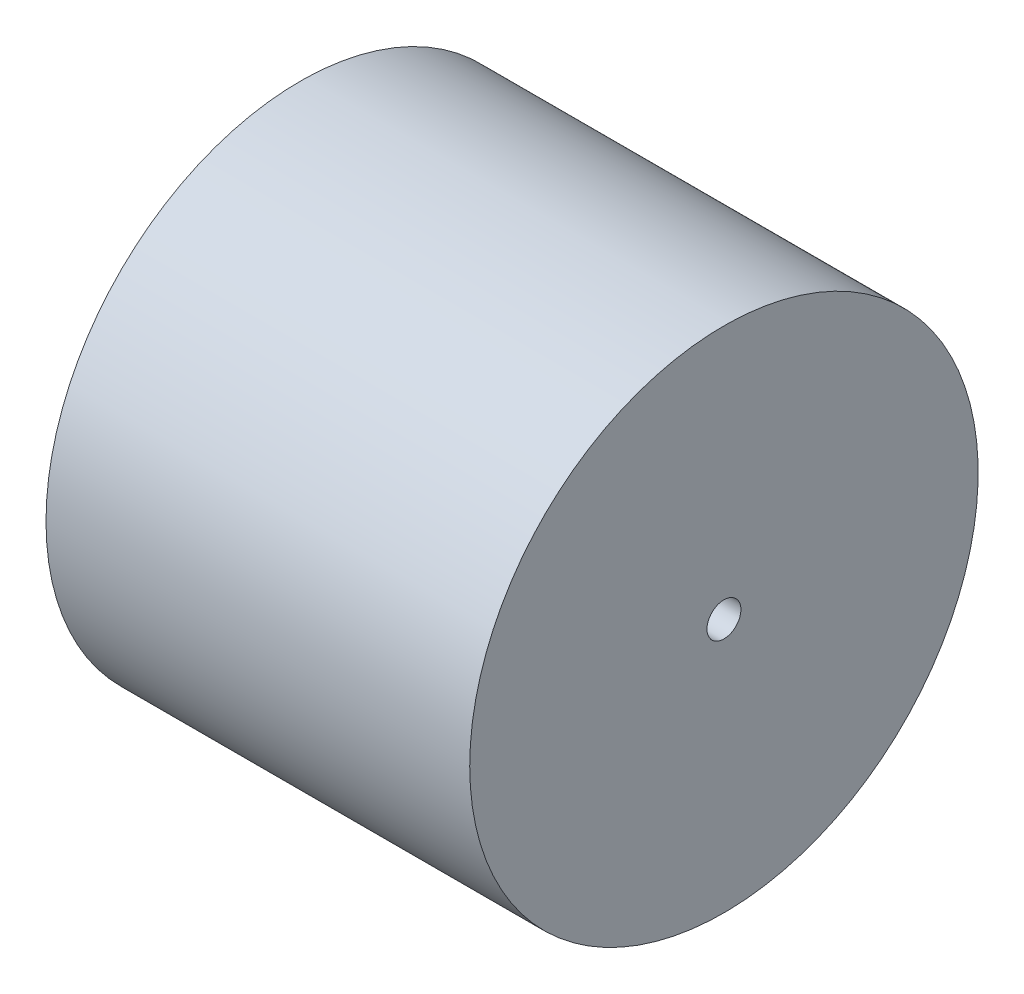
ISO-10303-21;
HEADER;
FILE_DESCRIPTION(('STEP AP214'),'2;1');
FILE_NAME('part.step','',(''),(''),'','','');
FILE_SCHEMA(('AUTOMOTIVE_DESIGN { 1 0 10303 214 1 1 1 1 }'));
ENDSEC;
DATA;
#1=APPLICATION_CONTEXT('core data for automotive mechanical design processes');
#2=APPLICATION_PROTOCOL_DEFINITION('international standard','automotive_design',2000,#1);
#3=PRODUCT_CONTEXT('',#1,'mechanical');
#4=PRODUCT('Part','Part','',(#3));
#5=PRODUCT_RELATED_PRODUCT_CATEGORY('part','',(#4));
#6=PRODUCT_DEFINITION_FORMATION('','',#4);
#7=PRODUCT_DEFINITION_CONTEXT('part definition',#1,'design');
#8=PRODUCT_DEFINITION('design','',#6,#7);
#9=PRODUCT_DEFINITION_SHAPE('','',#8);
#10=(LENGTH_UNIT() NAMED_UNIT(*) SI_UNIT(.MILLI.,.METRE.));
#11=(NAMED_UNIT(*) PLANE_ANGLE_UNIT() SI_UNIT($,.RADIAN.));
#12=(NAMED_UNIT(*) SI_UNIT($,.STERADIAN.) SOLID_ANGLE_UNIT());
#13=UNCERTAINTY_MEASURE_WITH_UNIT(LENGTH_MEASURE(1.E-05),#10,'distance_accuracy_value','');
#14=(GEOMETRIC_REPRESENTATION_CONTEXT(3) GLOBAL_UNCERTAINTY_ASSIGNED_CONTEXT((#13)) GLOBAL_UNIT_ASSIGNED_CONTEXT((#10,
#11,#12)) REPRESENTATION_CONTEXT('',''));
#15=CARTESIAN_POINT('',(0.,0.,0.));
#16=DIRECTION('',(0.,0.,1.));
#17=DIRECTION('',(1.,0.,0.));
#18=AXIS2_PLACEMENT_3D('',#15,#16,#17);
#19=CARTESIAN_POINT('',(5.,0.,0.));
#20=DIRECTION('',(-1.,0.,0.));
#21=DIRECTION('',(0.,0.,1.));
#22=AXIS2_PLACEMENT_3D('',#19,#20,#21);
#23=PLANE('',#22);
#24=CARTESIAN_POINT('',(5.,0.,0.));
#25=DIRECTION('',(1.,0.,0.));
#26=DIRECTION('',(0.,0.,-1.));
#27=AXIS2_PLACEMENT_3D('',#24,#25,#26);
#28=CIRCLE('',#27,1.2);
#29=CARTESIAN_POINT('',(5.,0.,-1.2));
#30=VERTEX_POINT('',#29);
#31=EDGE_CURVE('E66',#30,#30,#28,.T.);
#32=ORIENTED_EDGE('',*,*,#31,.F.);
#33=EDGE_LOOP('',(#32));
#34=FACE_BOUND('',#33,.T.);
#35=CARTESIAN_POINT('',(5.,0.,0.));
#36=DIRECTION('',(-1.,0.,0.));
#37=DIRECTION('',(0.,0.,1.));
#38=AXIS2_PLACEMENT_3D('',#35,#36,#37);
#39=CIRCLE('',#38,18.);
#40=CARTESIAN_POINT('',(5.,0.,18.));
#41=VERTEX_POINT('',#40);
#42=EDGE_CURVE('E55',#41,#41,#39,.T.);
#43=ORIENTED_EDGE('',*,*,#42,.F.);
#44=EDGE_LOOP('',(#43));
#45=FACE_BOUND('',#44,.T.);
#46=ADVANCED_FACE('F37',(#34,#45),#23,.F.);
#47=CARTESIAN_POINT('',(-25.,0.,0.));
#48=DIRECTION('',(-1.,0.,0.));
#49=DIRECTION('',(0.,0.,1.));
#50=AXIS2_PLACEMENT_3D('',#47,#48,#49);
#51=CYLINDRICAL_SURFACE('',#50,18.);
#52=CARTESIAN_POINT('',(-25.,0.,0.));
#53=DIRECTION('',(-1.,0.,0.));
#54=DIRECTION('',(0.,0.,1.));
#55=AXIS2_PLACEMENT_3D('',#52,#53,#54);
#56=CIRCLE('',#55,18.);
#57=CARTESIAN_POINT('',(-25.,0.,18.));
#58=VERTEX_POINT('',#57);
#59=EDGE_CURVE('E61',#58,#58,#56,.T.);
#60=ORIENTED_EDGE('',*,*,#59,.F.);
#61=EDGE_LOOP('',(#60));
#62=FACE_BOUND('',#61,.T.);
#63=ORIENTED_EDGE('',*,*,#42,.T.);
#64=EDGE_LOOP('',(#63));
#65=FACE_BOUND('',#64,.T.);
#66=ADVANCED_FACE('F103',(#62,#65),#51,.T.);
#67=CARTESIAN_POINT('',(-25.,18.,0.));
#68=DIRECTION('',(1.,0.,0.));
#69=DIRECTION('',(0.,0.,-1.));
#70=AXIS2_PLACEMENT_3D('',#67,#68,#69);
#71=PLANE('',#70);
#72=CARTESIAN_POINT('',(-25.,0.,-12.));
#73=DIRECTION('',(-1.,0.,0.));
#74=DIRECTION('',(0.,0.,1.));
#75=AXIS2_PLACEMENT_3D('',#72,#73,#74);
#76=CIRCLE('',#75,1.65);
#77=CARTESIAN_POINT('',(-25.,0.,-10.35));
#78=VERTEX_POINT('',#77);
#79=EDGE_CURVE('E82',#78,#78,#76,.T.);
#80=ORIENTED_EDGE('',*,*,#79,.F.);
#81=EDGE_LOOP('',(#80));
#82=FACE_BOUND('',#81,.T.);
#83=CARTESIAN_POINT('',(-25.,0.,12.));
#84=DIRECTION('',(-1.,0.,0.));
#85=DIRECTION('',(0.,0.,1.));
#86=AXIS2_PLACEMENT_3D('',#83,#84,#85);
#87=CIRCLE('',#86,1.65);
#88=CARTESIAN_POINT('',(-25.,0.,13.65));
#89=VERTEX_POINT('',#88);
#90=EDGE_CURVE('E74',#89,#89,#87,.T.);
#91=ORIENTED_EDGE('',*,*,#90,.F.);
#92=EDGE_LOOP('',(#91));
#93=FACE_BOUND('',#92,.T.);
#94=CARTESIAN_POINT('',(-25.,0.,0.));
#95=DIRECTION('',(-1.,0.,0.));
#96=DIRECTION('',(0.,0.,1.));
#97=AXIS2_PLACEMENT_3D('',#94,#95,#96);
#98=CIRCLE('',#97,3.5);
#99=CARTESIAN_POINT('',(-25.,0.,3.5));
#100=VERTEX_POINT('',#99);
#101=EDGE_CURVE('E50',#100,#100,#98,.T.);
#102=ORIENTED_EDGE('',*,*,#101,.F.);
#103=EDGE_LOOP('',(#102));
#104=FACE_BOUND('',#103,.T.);
#105=ORIENTED_EDGE('',*,*,#59,.T.);
#106=EDGE_LOOP('',(#105));
#107=FACE_BOUND('',#106,.T.);
#108=ADVANCED_FACE('F99',(#82,#93,#104,#107),#71,.F.);
#109=CARTESIAN_POINT('',(0.999999999999997,0.,0.));
#110=DIRECTION('',(1.,0.,0.));
#111=DIRECTION('',(0.,0.,-1.));
#112=AXIS2_PLACEMENT_3D('',#109,#110,#111);
#113=CYLINDRICAL_SURFACE('',#112,1.2);
#114=CARTESIAN_POINT('',(0.999999999999997,0.,0.));
#115=DIRECTION('',(1.,0.,0.));
#116=DIRECTION('',(0.,0.,-1.));
#117=AXIS2_PLACEMENT_3D('',#114,#115,#116);
#118=CIRCLE('',#117,1.2);
#119=CARTESIAN_POINT('',(0.999999999999997,0.,-1.2));
#120=VERTEX_POINT('',#119);
#121=EDGE_CURVE('E65',#120,#120,#118,.T.);
#122=ORIENTED_EDGE('',*,*,#121,.F.);
#123=EDGE_LOOP('',(#122));
#124=FACE_BOUND('',#123,.T.);
#125=ORIENTED_EDGE('',*,*,#31,.T.);
#126=EDGE_LOOP('',(#125));
#127=FACE_BOUND('',#126,.T.);
#128=ADVANCED_FACE('F102',(#124,#127),#113,.F.);
#129=CARTESIAN_POINT('',(0.999999999999997,0.,0.));
#130=DIRECTION('',(1.,0.,0.));
#131=DIRECTION('',(0.,0.,-1.));
#132=AXIS2_PLACEMENT_3D('',#129,#130,#131);
#133=PLANE('',#132);
#134=ORIENTED_EDGE('',*,*,#121,.T.);
#135=EDGE_LOOP('',(#134));
#136=FACE_BOUND('',#135,.T.);
#137=ADVANCED_FACE('F126',(#136),#133,.T.);
#138=CARTESIAN_POINT('',(-26.5,0.,0.));
#139=DIRECTION('',(1.,0.,0.));
#140=DIRECTION('',(0.,0.,-1.));
#141=AXIS2_PLACEMENT_3D('',#138,#139,#140);
#142=CYLINDRICAL_SURFACE('',#141,3.5);
#143=CARTESIAN_POINT('',(-26.25,0.,0.));
#144=DIRECTION('',(-1.,0.,0.));
#145=DIRECTION('',(0.,0.,1.));
#146=AXIS2_PLACEMENT_3D('',#143,#144,#145);
#147=CIRCLE('',#146,3.5);
#148=CARTESIAN_POINT('',(-26.25,0.,3.5));
#149=VERTEX_POINT('',#148);
#150=EDGE_CURVE('E10',#149,#149,#147,.F.);
#151=ORIENTED_EDGE('',*,*,#150,.T.);
#152=EDGE_LOOP('',(#151));
#153=FACE_BOUND('',#152,.T.);
#154=ORIENTED_EDGE('',*,*,#101,.T.);
#155=EDGE_LOOP('',(#154));
#156=FACE_BOUND('',#155,.T.);
#157=ADVANCED_FACE('F130',(#153,#156),#142,.T.);
#158=CARTESIAN_POINT('',(-26.5,0.,0.));
#159=DIRECTION('',(-1.,0.,0.));
#160=DIRECTION('',(0.,0.,1.));
#161=AXIS2_PLACEMENT_3D('',#158,#159,#160);
#162=PLANE('',#161);
#163=CARTESIAN_POINT('',(-26.5,0.,0.));
#164=DIRECTION('',(-1.,0.,0.));
#165=DIRECTION('',(0.,0.,1.));
#166=AXIS2_PLACEMENT_3D('',#163,#164,#165);
#167=CIRCLE('',#166,3.25);
#168=CARTESIAN_POINT('',(-26.5,0.,3.25));
#169=VERTEX_POINT('',#168);
#170=EDGE_CURVE('E45',#169,#169,#167,.T.);
#171=ORIENTED_EDGE('',*,*,#170,.T.);
#172=EDGE_LOOP('',(#171));
#173=FACE_BOUND('',#172,.T.);
#174=ADVANCED_FACE('F134',(#173),#162,.T.);
#175=CARTESIAN_POINT('',(-26.25,0.,0.));
#176=DIRECTION('',(-1.,0.,0.));
#177=DIRECTION('',(0.,0.,1.));
#178=AXIS2_PLACEMENT_3D('',#175,#176,#177);
#179=TOROIDAL_SURFACE('',#178,3.25,0.25);
#180=ORIENTED_EDGE('',*,*,#150,.F.);
#181=EDGE_LOOP('',(#180));
#182=FACE_BOUND('',#181,.T.);
#183=ORIENTED_EDGE('',*,*,#170,.F.);
#184=EDGE_LOOP('',(#183));
#185=FACE_BOUND('',#184,.T.);
#186=ADVANCED_FACE('F39',(#182,#185),#179,.T.);
#187=CARTESIAN_POINT('',(-23.,0.,12.));
#188=DIRECTION('',(-1.,0.,0.));
#189=DIRECTION('',(0.,0.,1.));
#190=AXIS2_PLACEMENT_3D('',#187,#188,#189);
#191=CYLINDRICAL_SURFACE('',#190,1.65);
#192=CARTESIAN_POINT('',(-23.,0.,12.));
#193=DIRECTION('',(-1.,0.,0.));
#194=DIRECTION('',(0.,0.,1.));
#195=AXIS2_PLACEMENT_3D('',#192,#193,#194);
#196=CIRCLE('',#195,1.65);
#197=CARTESIAN_POINT('',(-23.,0.,13.65));
#198=VERTEX_POINT('',#197);
#199=EDGE_CURVE('E78',#198,#198,#196,.T.);
#200=ORIENTED_EDGE('',*,*,#199,.F.);
#201=EDGE_LOOP('',(#200));
#202=FACE_BOUND('',#201,.T.);
#203=ORIENTED_EDGE('',*,*,#90,.T.);
#204=EDGE_LOOP('',(#203));
#205=FACE_BOUND('',#204,.T.);
#206=ADVANCED_FACE('F137',(#202,#205),#191,.F.);
#207=CARTESIAN_POINT('',(-23.,0.,12.));
#208=DIRECTION('',(-1.,0.,0.));
#209=DIRECTION('',(0.,0.,1.));
#210=AXIS2_PLACEMENT_3D('',#207,#208,#209);
#211=PLANE('',#210);
#212=ORIENTED_EDGE('',*,*,#199,.T.);
#213=EDGE_LOOP('',(#212));
#214=FACE_BOUND('',#213,.T.);
#215=ADVANCED_FACE('F95',(#214),#211,.T.);
#216=CARTESIAN_POINT('',(-23.,0.,-12.));
#217=DIRECTION('',(-1.,0.,0.));
#218=DIRECTION('',(0.,0.,1.));
#219=AXIS2_PLACEMENT_3D('',#216,#217,#218);
#220=CYLINDRICAL_SURFACE('',#219,1.65);
#221=CARTESIAN_POINT('',(-23.,0.,-12.));
#222=DIRECTION('',(-1.,0.,0.));
#223=DIRECTION('',(0.,0.,1.));
#224=AXIS2_PLACEMENT_3D('',#221,#222,#223);
#225=CIRCLE('',#224,1.65);
#226=CARTESIAN_POINT('',(-23.,0.,-10.35));
#227=VERTEX_POINT('',#226);
#228=EDGE_CURVE('E70',#227,#227,#225,.T.);
#229=ORIENTED_EDGE('',*,*,#228,.F.);
#230=EDGE_LOOP('',(#229));
#231=FACE_BOUND('',#230,.T.);
#232=ORIENTED_EDGE('',*,*,#79,.T.);
#233=EDGE_LOOP('',(#232));
#234=FACE_BOUND('',#233,.T.);
#235=ADVANCED_FACE('F92',(#231,#234),#220,.F.);
#236=CARTESIAN_POINT('',(-23.,0.,-12.));
#237=DIRECTION('',(-1.,0.,0.));
#238=DIRECTION('',(0.,0.,1.));
#239=AXIS2_PLACEMENT_3D('',#236,#237,#238);
#240=PLANE('',#239);
#241=ORIENTED_EDGE('',*,*,#228,.T.);
#242=EDGE_LOOP('',(#241));
#243=FACE_BOUND('',#242,.T.);
#244=ADVANCED_FACE('F90',(#243),#240,.T.);
#245=CLOSED_SHELL('',(#46,#66,#108,#128,#137,#157,#174,#186,#206,#215,#235,#244));
#246=MANIFOLD_SOLID_BREP('B2',#245);
#247=ADVANCED_BREP_SHAPE_REPRESENTATION('',(#18,#246),#14);
#248=SHAPE_DEFINITION_REPRESENTATION(#9,#247);
ENDSEC;
END-ISO-10303-21;
